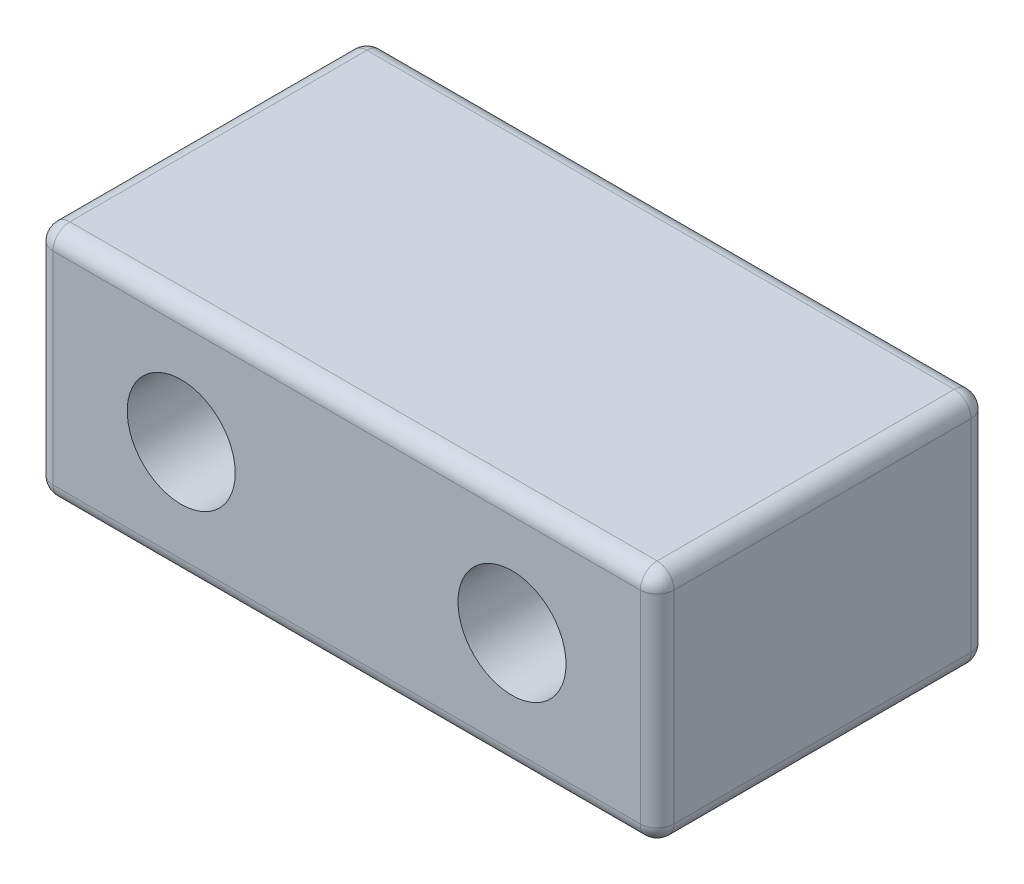
ISO-10303-21;
HEADER;
FILE_DESCRIPTION(('STEP AP214'),'2;1');
FILE_NAME('part.step','',(''),(''),'','','');
FILE_SCHEMA(('AUTOMOTIVE_DESIGN { 1 0 10303 214 1 1 1 1 }'));
ENDSEC;
DATA;
#1=APPLICATION_CONTEXT('core data for automotive mechanical design processes');
#2=APPLICATION_PROTOCOL_DEFINITION('international standard','automotive_design',2000,#1);
#3=PRODUCT_CONTEXT('',#1,'mechanical');
#4=PRODUCT('Part','Part','',(#3));
#5=PRODUCT_RELATED_PRODUCT_CATEGORY('part','',(#4));
#6=PRODUCT_DEFINITION_FORMATION('','',#4);
#7=PRODUCT_DEFINITION_CONTEXT('part definition',#1,'design');
#8=PRODUCT_DEFINITION('design','',#6,#7);
#9=PRODUCT_DEFINITION_SHAPE('','',#8);
#10=(LENGTH_UNIT() NAMED_UNIT(*) SI_UNIT(.MILLI.,.METRE.));
#11=(NAMED_UNIT(*) PLANE_ANGLE_UNIT() SI_UNIT($,.RADIAN.));
#12=(NAMED_UNIT(*) SI_UNIT($,.STERADIAN.) SOLID_ANGLE_UNIT());
#13=UNCERTAINTY_MEASURE_WITH_UNIT(LENGTH_MEASURE(1.E-05),#10,'distance_accuracy_value','');
#14=(GEOMETRIC_REPRESENTATION_CONTEXT(3) GLOBAL_UNCERTAINTY_ASSIGNED_CONTEXT((#13)) GLOBAL_UNIT_ASSIGNED_CONTEXT((#10,
#11,#12)) REPRESENTATION_CONTEXT('',''));
#15=CARTESIAN_POINT('',(0.,0.,0.));
#16=DIRECTION('',(0.,0.,1.));
#17=DIRECTION('',(1.,0.,0.));
#18=AXIS2_PLACEMENT_3D('',#15,#16,#17);
#19=CARTESIAN_POINT('',(0.,0.,9.8));
#20=DIRECTION('',(1.,0.,0.));
#21=DIRECTION('',(0.,0.,-1.));
#22=AXIS2_PLACEMENT_3D('',#19,#20,#21);
#23=PLANE('',#22);
#24=DIRECTION('',(0.,0.,-1.));
#25=VECTOR('',#24,1.);
#26=CARTESIAN_POINT('',(0.,6.5,9.8));
#27=LINE('',#26,#25);
#28=CARTESIAN_POINT('',(0.,6.5,9.3));
#29=VERTEX_POINT('',#28);
#30=CARTESIAN_POINT('',(0.,6.5,0.5));
#31=VERTEX_POINT('',#30);
#32=EDGE_CURVE('E133',#29,#31,#27,.T.);
#33=ORIENTED_EDGE('',*,*,#32,.T.);
#34=DIRECTION('',(0.,-1.,0.));
#35=VECTOR('',#34,1.);
#36=CARTESIAN_POINT('',(0.,0.,0.5));
#37=LINE('',#36,#35);
#38=CARTESIAN_POINT('',(0.,0.5,0.5));
#39=VERTEX_POINT('',#38);
#40=EDGE_CURVE('E129',#31,#39,#37,.T.);
#41=ORIENTED_EDGE('',*,*,#40,.T.);
#42=DIRECTION('',(0.,0.,-1.));
#43=VECTOR('',#42,1.);
#44=CARTESIAN_POINT('',(0.,0.5,9.8));
#45=LINE('',#44,#43);
#46=CARTESIAN_POINT('',(0.,0.5,9.3));
#47=VERTEX_POINT('',#46);
#48=EDGE_CURVE('E124',#39,#47,#45,.F.);
#49=ORIENTED_EDGE('',*,*,#48,.T.);
#50=DIRECTION('',(0.,-1.,0.));
#51=VECTOR('',#50,1.);
#52=CARTESIAN_POINT('',(0.,0.,9.3));
#53=LINE('',#52,#51);
#54=EDGE_CURVE('E126',#47,#29,#53,.F.);
#55=ORIENTED_EDGE('',*,*,#54,.T.);
#56=EDGE_LOOP('',(#33,#41,#49,#55));
#57=FACE_BOUND('',#56,.T.);
#58=ADVANCED_FACE('F35',(#57),#23,.F.);
#59=CARTESIAN_POINT('',(0.,0.,9.8));
#60=DIRECTION('',(0.,1.,0.));
#61=DIRECTION('',(0.,0.,1.));
#62=AXIS2_PLACEMENT_3D('',#59,#60,#61);
#63=PLANE('',#62);
#64=DIRECTION('',(0.,0.,-1.));
#65=VECTOR('',#64,1.);
#66=CARTESIAN_POINT('',(0.5,0.,9.8));
#67=LINE('',#66,#65);
#68=CARTESIAN_POINT('',(0.5,0.,9.3));
#69=VERTEX_POINT('',#68);
#70=CARTESIAN_POINT('',(0.5,0.,0.5));
#71=VERTEX_POINT('',#70);
#72=EDGE_CURVE('E155',#69,#71,#67,.T.);
#73=ORIENTED_EDGE('',*,*,#72,.T.);
#74=DIRECTION('',(1.,0.,0.));
#75=VECTOR('',#74,1.);
#76=CARTESIAN_POINT('',(18.4,0.,0.5));
#77=LINE('',#76,#75);
#78=CARTESIAN_POINT('',(17.9,0.,0.5));
#79=VERTEX_POINT('',#78);
#80=EDGE_CURVE('E231',#71,#79,#77,.T.);
#81=ORIENTED_EDGE('',*,*,#80,.T.);
#82=DIRECTION('',(0.,0.,-1.));
#83=VECTOR('',#82,1.);
#84=CARTESIAN_POINT('',(17.9,0.,9.8));
#85=LINE('',#84,#83);
#86=CARTESIAN_POINT('',(17.9,0.,9.3));
#87=VERTEX_POINT('',#86);
#88=EDGE_CURVE('E229',#79,#87,#85,.F.);
#89=ORIENTED_EDGE('',*,*,#88,.T.);
#90=DIRECTION('',(1.,0.,0.));
#91=VECTOR('',#90,1.);
#92=CARTESIAN_POINT('',(0.,0.,9.3));
#93=LINE('',#92,#91);
#94=EDGE_CURVE('E226',#87,#69,#93,.F.);
#95=ORIENTED_EDGE('',*,*,#94,.T.);
#96=EDGE_LOOP('',(#73,#81,#89,#95));
#97=FACE_BOUND('',#96,.T.);
#98=ADVANCED_FACE('F297',(#97),#63,.F.);
#99=CARTESIAN_POINT('',(18.4,0.,9.8));
#100=DIRECTION('',(-1.,0.,0.));
#101=DIRECTION('',(0.,0.,1.));
#102=AXIS2_PLACEMENT_3D('',#99,#100,#101);
#103=PLANE('',#102);
#104=DIRECTION('',(0.,1.,0.));
#105=VECTOR('',#104,1.);
#106=CARTESIAN_POINT('',(18.4,7.,0.5));
#107=LINE('',#106,#105);
#108=CARTESIAN_POINT('',(18.4,0.5,0.5));
#109=VERTEX_POINT('',#108);
#110=CARTESIAN_POINT('',(18.4,6.5,0.5));
#111=VERTEX_POINT('',#110);
#112=EDGE_CURVE('E238',#109,#111,#107,.T.);
#113=ORIENTED_EDGE('',*,*,#112,.T.);
#114=DIRECTION('',(0.,0.,-1.));
#115=VECTOR('',#114,1.);
#116=CARTESIAN_POINT('',(18.4,6.5,9.8));
#117=LINE('',#116,#115);
#118=CARTESIAN_POINT('',(18.4,6.5,9.3));
#119=VERTEX_POINT('',#118);
#120=EDGE_CURVE('E241',#111,#119,#117,.F.);
#121=ORIENTED_EDGE('',*,*,#120,.T.);
#122=DIRECTION('',(0.,1.,0.));
#123=VECTOR('',#122,1.);
#124=CARTESIAN_POINT('',(18.4,0.,9.3));
#125=LINE('',#124,#123);
#126=CARTESIAN_POINT('',(18.4,0.5,9.3));
#127=VERTEX_POINT('',#126);
#128=EDGE_CURVE('E236',#119,#127,#125,.F.);
#129=ORIENTED_EDGE('',*,*,#128,.T.);
#130=DIRECTION('',(0.,0.,-1.));
#131=VECTOR('',#130,1.);
#132=CARTESIAN_POINT('',(18.4,0.5,9.8));
#133=LINE('',#132,#131);
#134=EDGE_CURVE('E234',#127,#109,#133,.T.);
#135=ORIENTED_EDGE('',*,*,#134,.T.);
#136=EDGE_LOOP('',(#113,#121,#129,#135));
#137=FACE_BOUND('',#136,.T.);
#138=ADVANCED_FACE('F309',(#137),#103,.F.);
#139=CARTESIAN_POINT('',(0.,7.,9.8));
#140=DIRECTION('',(0.,-1.,0.));
#141=DIRECTION('',(0.,0.,-1.));
#142=AXIS2_PLACEMENT_3D('',#139,#140,#141);
#143=PLANE('',#142);
#144=DIRECTION('',(-1.,0.,0.));
#145=VECTOR('',#144,1.);
#146=CARTESIAN_POINT('',(0.,7.,0.5));
#147=LINE('',#146,#145);
#148=CARTESIAN_POINT('',(17.9,7.,0.5));
#149=VERTEX_POINT('',#148);
#150=CARTESIAN_POINT('',(0.5,7.,0.5));
#151=VERTEX_POINT('',#150);
#152=EDGE_CURVE('E247',#149,#151,#147,.T.);
#153=ORIENTED_EDGE('',*,*,#152,.T.);
#154=DIRECTION('',(0.,0.,-1.));
#155=VECTOR('',#154,1.);
#156=CARTESIAN_POINT('',(0.5,7.,9.8));
#157=LINE('',#156,#155);
#158=CARTESIAN_POINT('',(0.5,7.,9.3));
#159=VERTEX_POINT('',#158);
#160=EDGE_CURVE('E250',#151,#159,#157,.F.);
#161=ORIENTED_EDGE('',*,*,#160,.T.);
#162=DIRECTION('',(-1.,0.,0.));
#163=VECTOR('',#162,1.);
#164=CARTESIAN_POINT('',(0.,7.,9.3));
#165=LINE('',#164,#163);
#166=CARTESIAN_POINT('',(17.9,7.,9.3));
#167=VERTEX_POINT('',#166);
#168=EDGE_CURVE('E245',#159,#167,#165,.F.);
#169=ORIENTED_EDGE('',*,*,#168,.T.);
#170=DIRECTION('',(0.,0.,-1.));
#171=VECTOR('',#170,1.);
#172=CARTESIAN_POINT('',(17.9,7.,9.8));
#173=LINE('',#172,#171);
#174=EDGE_CURVE('E243',#167,#149,#173,.T.);
#175=ORIENTED_EDGE('',*,*,#174,.T.);
#176=EDGE_LOOP('',(#153,#161,#169,#175));
#177=FACE_BOUND('',#176,.T.);
#178=ADVANCED_FACE('F326',(#177),#143,.F.);
#179=CARTESIAN_POINT('',(0.,0.,9.8));
#180=DIRECTION('',(0.,0.,-1.));
#181=DIRECTION('',(-1.,0.,0.));
#182=AXIS2_PLACEMENT_3D('',#179,#180,#181);
#183=PLANE('',#182);
#184=DIRECTION('',(1.,0.,0.));
#185=VECTOR('',#184,1.);
#186=CARTESIAN_POINT('',(0.,0.5,9.8));
#187=LINE('',#186,#185);
#188=CARTESIAN_POINT('',(0.5,0.5,9.8));
#189=VERTEX_POINT('',#188);
#190=CARTESIAN_POINT('',(17.9,0.5,9.8));
#191=VERTEX_POINT('',#190);
#192=EDGE_CURVE('E252',#189,#191,#187,.T.);
#193=ORIENTED_EDGE('',*,*,#192,.T.);
#194=DIRECTION('',(0.,1.,0.));
#195=VECTOR('',#194,1.);
#196=CARTESIAN_POINT('',(17.9,0.,9.8));
#197=LINE('',#196,#195);
#198=CARTESIAN_POINT('',(17.9,6.5,9.8));
#199=VERTEX_POINT('',#198);
#200=EDGE_CURVE('E11',#191,#199,#197,.T.);
#201=ORIENTED_EDGE('',*,*,#200,.T.);
#202=DIRECTION('',(-1.,0.,0.));
#203=VECTOR('',#202,1.);
#204=CARTESIAN_POINT('',(0.,6.5,9.8));
#205=LINE('',#204,#203);
#206=CARTESIAN_POINT('',(0.5,6.5,9.8));
#207=VERTEX_POINT('',#206);
#208=EDGE_CURVE('E44',#199,#207,#205,.T.);
#209=ORIENTED_EDGE('',*,*,#208,.T.);
#210=DIRECTION('',(0.,-1.,0.));
#211=VECTOR('',#210,1.);
#212=CARTESIAN_POINT('',(0.5,0.,9.8));
#213=LINE('',#212,#211);
#214=EDGE_CURVE('E254',#207,#189,#213,.T.);
#215=ORIENTED_EDGE('',*,*,#214,.T.);
#216=EDGE_LOOP('',(#193,#201,#209,#215));
#217=FACE_BOUND('',#216,.T.);
#218=CARTESIAN_POINT('',(4.3,3.5,9.8));
#219=DIRECTION('',(0.,0.,1.));
#220=DIRECTION('',(1.,0.,0.));
#221=AXIS2_PLACEMENT_3D('',#218,#219,#220);
#222=CIRCLE('',#221,1.6);
#223=CARTESIAN_POINT('',(5.9,3.5,9.8));
#224=VERTEX_POINT('',#223);
#225=EDGE_CURVE('E211',#224,#224,#222,.T.);
#226=ORIENTED_EDGE('',*,*,#225,.F.);
#227=EDGE_LOOP('',(#226));
#228=FACE_BOUND('',#227,.T.);
#229=CARTESIAN_POINT('',(14.1,3.5,9.8));
#230=DIRECTION('',(0.,0.,1.));
#231=DIRECTION('',(1.,0.,0.));
#232=AXIS2_PLACEMENT_3D('',#229,#230,#231);
#233=CIRCLE('',#232,1.6);
#234=CARTESIAN_POINT('',(15.7,3.5,9.8));
#235=VERTEX_POINT('',#234);
#236=EDGE_CURVE('E201',#235,#235,#233,.T.);
#237=ORIENTED_EDGE('',*,*,#236,.F.);
#238=EDGE_LOOP('',(#237));
#239=FACE_BOUND('',#238,.T.);
#240=ADVANCED_FACE('F304',(#217,#228,#239),#183,.F.);
#241=CARTESIAN_POINT('',(0.,0.,0.));
#242=DIRECTION('',(0.,0.,-1.));
#243=DIRECTION('',(-1.,0.,0.));
#244=AXIS2_PLACEMENT_3D('',#241,#242,#243);
#245=PLANE('',#244);
#246=DIRECTION('',(1.,0.,0.));
#247=VECTOR('',#246,1.);
#248=CARTESIAN_POINT('',(0.,0.5,0.));
#249=LINE('',#248,#247);
#250=CARTESIAN_POINT('',(17.9,0.5,0.));
#251=VERTEX_POINT('',#250);
#252=CARTESIAN_POINT('',(0.5,0.5,0.));
#253=VERTEX_POINT('',#252);
#254=EDGE_CURVE('E221',#251,#253,#249,.F.);
#255=ORIENTED_EDGE('',*,*,#254,.T.);
#256=DIRECTION('',(0.,-1.,0.));
#257=VECTOR('',#256,1.);
#258=CARTESIAN_POINT('',(0.5,7.,0.));
#259=LINE('',#258,#257);
#260=CARTESIAN_POINT('',(0.5,6.5,0.));
#261=VERTEX_POINT('',#260);
#262=EDGE_CURVE('E223',#253,#261,#259,.F.);
#263=ORIENTED_EDGE('',*,*,#262,.T.);
#264=DIRECTION('',(-1.,0.,0.));
#265=VECTOR('',#264,1.);
#266=CARTESIAN_POINT('',(18.4,6.5,0.));
#267=LINE('',#266,#265);
#268=CARTESIAN_POINT('',(17.9,6.5,0.));
#269=VERTEX_POINT('',#268);
#270=EDGE_CURVE('E217',#261,#269,#267,.F.);
#271=ORIENTED_EDGE('',*,*,#270,.T.);
#272=DIRECTION('',(0.,1.,0.));
#273=VECTOR('',#272,1.);
#274=CARTESIAN_POINT('',(17.9,0.,0.));
#275=LINE('',#274,#273);
#276=EDGE_CURVE('E219',#269,#251,#275,.F.);
#277=ORIENTED_EDGE('',*,*,#276,.T.);
#278=EDGE_LOOP('',(#255,#263,#271,#277));
#279=FACE_BOUND('',#278,.T.);
#280=CARTESIAN_POINT('',(4.3,3.5,0.));
#281=DIRECTION('',(0.,0.,1.));
#282=DIRECTION('',(1.,0.,0.));
#283=AXIS2_PLACEMENT_3D('',#280,#281,#282);
#284=CIRCLE('',#283,1.6);
#285=CARTESIAN_POINT('',(5.9,3.5,0.));
#286=VERTEX_POINT('',#285);
#287=EDGE_CURVE('E144',#286,#286,#284,.T.);
#288=ORIENTED_EDGE('',*,*,#287,.T.);
#289=EDGE_LOOP('',(#288));
#290=FACE_BOUND('',#289,.T.);
#291=CARTESIAN_POINT('',(14.1,3.5,0.));
#292=DIRECTION('',(0.,0.,1.));
#293=DIRECTION('',(1.,0.,0.));
#294=AXIS2_PLACEMENT_3D('',#291,#292,#293);
#295=CIRCLE('',#294,1.6);
#296=CARTESIAN_POINT('',(15.7,3.5,0.));
#297=VERTEX_POINT('',#296);
#298=EDGE_CURVE('E206',#297,#297,#295,.T.);
#299=ORIENTED_EDGE('',*,*,#298,.T.);
#300=EDGE_LOOP('',(#299));
#301=FACE_BOUND('',#300,.T.);
#302=ADVANCED_FACE('F283',(#279,#290,#301),#245,.T.);
#303=CARTESIAN_POINT('',(14.1,3.5,0.));
#304=DIRECTION('',(0.,0.,1.));
#305=DIRECTION('',(1.,0.,0.));
#306=AXIS2_PLACEMENT_3D('',#303,#304,#305);
#307=CYLINDRICAL_SURFACE('',#306,1.6);
#308=ORIENTED_EDGE('',*,*,#298,.F.);
#309=EDGE_LOOP('',(#308));
#310=FACE_BOUND('',#309,.T.);
#311=ORIENTED_EDGE('',*,*,#236,.T.);
#312=EDGE_LOOP('',(#311));
#313=FACE_BOUND('',#312,.T.);
#314=ADVANCED_FACE('F395',(#310,#313),#307,.F.);
#315=CARTESIAN_POINT('',(4.3,3.5,0.));
#316=DIRECTION('',(0.,0.,1.));
#317=DIRECTION('',(1.,0.,0.));
#318=AXIS2_PLACEMENT_3D('',#315,#316,#317);
#319=CYLINDRICAL_SURFACE('',#318,1.6);
#320=ORIENTED_EDGE('',*,*,#287,.F.);
#321=EDGE_LOOP('',(#320));
#322=FACE_BOUND('',#321,.T.);
#323=ORIENTED_EDGE('',*,*,#225,.T.);
#324=EDGE_LOOP('',(#323));
#325=FACE_BOUND('',#324,.T.);
#326=ADVANCED_FACE('F391',(#322,#325),#319,.F.);
#327=CARTESIAN_POINT('',(17.9,0.,9.3));
#328=DIRECTION('',(0.,1.,0.));
#329=DIRECTION('',(0.,0.,1.));
#330=AXIS2_PLACEMENT_3D('',#327,#328,#329);
#331=CYLINDRICAL_SURFACE('',#330,0.5);
#332=CARTESIAN_POINT('',(17.9,6.5,9.3));
#333=DIRECTION('',(0.,1.,0.));
#334=DIRECTION('',(0.,0.,1.));
#335=AXIS2_PLACEMENT_3D('',#332,#333,#334);
#336=CIRCLE('',#335,0.5);
#337=EDGE_CURVE('E39',#199,#119,#336,.T.);
#338=ORIENTED_EDGE('',*,*,#337,.F.);
#339=ORIENTED_EDGE('',*,*,#200,.F.);
#340=CARTESIAN_POINT('',(17.9,0.5,9.3));
#341=DIRECTION('',(0.,-1.,0.));
#342=DIRECTION('',(0.,0.,-1.));
#343=AXIS2_PLACEMENT_3D('',#340,#341,#342);
#344=CIRCLE('',#343,0.5);
#345=EDGE_CURVE('E194',#127,#191,#344,.T.);
#346=ORIENTED_EDGE('',*,*,#345,.F.);
#347=ORIENTED_EDGE('',*,*,#128,.F.);
#348=EDGE_LOOP('',(#338,#339,#346,#347));
#349=FACE_BOUND('',#348,.T.);
#350=ADVANCED_FACE('F37',(#349),#331,.T.);
#351=CARTESIAN_POINT('',(17.9,6.5,9.3));
#352=DIRECTION('',(1.,0.,0.));
#353=DIRECTION('',(0.,0.,-1.));
#354=AXIS2_PLACEMENT_3D('',#351,#352,#353);
#355=SPHERICAL_SURFACE('',#354,0.5);
#356=CARTESIAN_POINT('',(17.9,6.5,9.3));
#357=DIRECTION('',(1.,0.,0.));
#358=DIRECTION('',(0.,0.,-1.));
#359=AXIS2_PLACEMENT_3D('',#356,#357,#358);
#360=CIRCLE('',#359,0.5);
#361=EDGE_CURVE('E190',#199,#167,#360,.F.);
#362=ORIENTED_EDGE('',*,*,#361,.F.);
#363=ORIENTED_EDGE('',*,*,#337,.T.);
#364=CARTESIAN_POINT('',(17.9,6.5,9.3));
#365=DIRECTION('',(0.,0.,1.));
#366=DIRECTION('',(1.,0.,0.));
#367=AXIS2_PLACEMENT_3D('',#364,#365,#366);
#368=CIRCLE('',#367,0.5);
#369=EDGE_CURVE('E192',#167,#119,#368,.F.);
#370=ORIENTED_EDGE('',*,*,#369,.F.);
#371=EDGE_LOOP('',(#362,#363,#370));
#372=FACE_BOUND('',#371,.T.);
#373=ADVANCED_FACE('F317',(#372),#355,.T.);
#374=CARTESIAN_POINT('',(17.9,0.5,9.3));
#375=DIRECTION('',(0.,0.,1.));
#376=DIRECTION('',(1.,0.,0.));
#377=AXIS2_PLACEMENT_3D('',#374,#375,#376);
#378=SPHERICAL_SURFACE('',#377,0.5);
#379=CARTESIAN_POINT('',(17.9,0.5,9.3));
#380=DIRECTION('',(0.,0.,1.));
#381=DIRECTION('',(1.,0.,0.));
#382=AXIS2_PLACEMENT_3D('',#379,#380,#381);
#383=CIRCLE('',#382,0.5);
#384=EDGE_CURVE('E184',#127,#87,#383,.F.);
#385=ORIENTED_EDGE('',*,*,#384,.F.);
#386=ORIENTED_EDGE('',*,*,#345,.T.);
#387=CARTESIAN_POINT('',(17.9,0.5,9.3));
#388=DIRECTION('',(1.,0.,0.));
#389=DIRECTION('',(0.,0.,-1.));
#390=AXIS2_PLACEMENT_3D('',#387,#388,#389);
#391=CIRCLE('',#390,0.5);
#392=EDGE_CURVE('E187',#87,#191,#391,.F.);
#393=ORIENTED_EDGE('',*,*,#392,.F.);
#394=EDGE_LOOP('',(#385,#386,#393));
#395=FACE_BOUND('',#394,.T.);
#396=ADVANCED_FACE('F385',(#395),#378,.T.);
#397=CARTESIAN_POINT('',(17.9,6.5,9.8));
#398=DIRECTION('',(0.,0.,-1.));
#399=DIRECTION('',(-1.,0.,0.));
#400=AXIS2_PLACEMENT_3D('',#397,#398,#399);
#401=CYLINDRICAL_SURFACE('',#400,0.5);
#402=ORIENTED_EDGE('',*,*,#369,.T.);
#403=ORIENTED_EDGE('',*,*,#120,.F.);
#404=CARTESIAN_POINT('',(17.9,6.5,0.5));
#405=DIRECTION('',(0.,0.,-1.));
#406=DIRECTION('',(-1.,0.,0.));
#407=AXIS2_PLACEMENT_3D('',#404,#405,#406);
#408=CIRCLE('',#407,0.5);
#409=EDGE_CURVE('E179',#149,#111,#408,.T.);
#410=ORIENTED_EDGE('',*,*,#409,.F.);
#411=ORIENTED_EDGE('',*,*,#174,.F.);
#412=EDGE_LOOP('',(#402,#403,#410,#411));
#413=FACE_BOUND('',#412,.T.);
#414=ADVANCED_FACE('F315',(#413),#401,.T.);
#415=CARTESIAN_POINT('',(0.,6.5,9.3));
#416=DIRECTION('',(-1.,0.,0.));
#417=DIRECTION('',(0.,0.,1.));
#418=AXIS2_PLACEMENT_3D('',#415,#416,#417);
#419=CYLINDRICAL_SURFACE('',#418,0.5);
#420=ORIENTED_EDGE('',*,*,#361,.T.);
#421=ORIENTED_EDGE('',*,*,#168,.F.);
#422=CARTESIAN_POINT('',(0.5,6.5,9.3));
#423=DIRECTION('',(-1.,0.,0.));
#424=DIRECTION('',(0.,0.,1.));
#425=AXIS2_PLACEMENT_3D('',#422,#423,#424);
#426=CIRCLE('',#425,0.5);
#427=EDGE_CURVE('E176',#207,#159,#426,.T.);
#428=ORIENTED_EDGE('',*,*,#427,.F.);
#429=ORIENTED_EDGE('',*,*,#208,.F.);
#430=EDGE_LOOP('',(#420,#421,#428,#429));
#431=FACE_BOUND('',#430,.T.);
#432=ADVANCED_FACE('F319',(#431),#419,.T.);
#433=CARTESIAN_POINT('',(0.5,0.,9.3));
#434=DIRECTION('',(0.,-1.,0.));
#435=DIRECTION('',(0.,0.,-1.));
#436=AXIS2_PLACEMENT_3D('',#433,#434,#435);
#437=CYLINDRICAL_SURFACE('',#436,0.5);
#438=CARTESIAN_POINT('',(0.5,0.5,9.3));
#439=DIRECTION('',(0.,-1.,0.));
#440=DIRECTION('',(0.,0.,-1.));
#441=AXIS2_PLACEMENT_3D('',#438,#439,#440);
#442=CIRCLE('',#441,0.5);
#443=EDGE_CURVE('E139',#189,#47,#442,.T.);
#444=ORIENTED_EDGE('',*,*,#443,.F.);
#445=ORIENTED_EDGE('',*,*,#214,.F.);
#446=CARTESIAN_POINT('',(0.5,6.5,9.3));
#447=DIRECTION('',(0.,1.,0.));
#448=DIRECTION('',(0.,0.,1.));
#449=AXIS2_PLACEMENT_3D('',#446,#447,#448);
#450=CIRCLE('',#449,0.5);
#451=EDGE_CURVE('E142',#29,#207,#450,.T.);
#452=ORIENTED_EDGE('',*,*,#451,.F.);
#453=ORIENTED_EDGE('',*,*,#54,.F.);
#454=EDGE_LOOP('',(#444,#445,#452,#453));
#455=FACE_BOUND('',#454,.T.);
#456=ADVANCED_FACE('F138',(#455),#437,.T.);
#457=CARTESIAN_POINT('',(0.,0.5,9.3));
#458=DIRECTION('',(1.,0.,0.));
#459=DIRECTION('',(0.,0.,-1.));
#460=AXIS2_PLACEMENT_3D('',#457,#458,#459);
#461=CYLINDRICAL_SURFACE('',#460,0.5);
#462=ORIENTED_EDGE('',*,*,#392,.T.);
#463=ORIENTED_EDGE('',*,*,#192,.F.);
#464=CARTESIAN_POINT('',(0.5,0.5,9.3));
#465=DIRECTION('',(-1.,0.,0.));
#466=DIRECTION('',(0.,0.,1.));
#467=AXIS2_PLACEMENT_3D('',#464,#465,#466);
#468=CIRCLE('',#467,0.5);
#469=EDGE_CURVE('E152',#69,#189,#468,.T.);
#470=ORIENTED_EDGE('',*,*,#469,.F.);
#471=ORIENTED_EDGE('',*,*,#94,.F.);
#472=EDGE_LOOP('',(#462,#463,#470,#471));
#473=FACE_BOUND('',#472,.T.);
#474=ADVANCED_FACE('F302',(#473),#461,.T.);
#475=CARTESIAN_POINT('',(17.9,0.5,9.8));
#476=DIRECTION('',(0.,0.,-1.));
#477=DIRECTION('',(-1.,0.,0.));
#478=AXIS2_PLACEMENT_3D('',#475,#476,#477);
#479=CYLINDRICAL_SURFACE('',#478,0.5);
#480=ORIENTED_EDGE('',*,*,#384,.T.);
#481=ORIENTED_EDGE('',*,*,#88,.F.);
#482=CARTESIAN_POINT('',(17.9,0.5,0.5));
#483=DIRECTION('',(0.,0.,-1.));
#484=DIRECTION('',(-1.,0.,0.));
#485=AXIS2_PLACEMENT_3D('',#482,#483,#484);
#486=CIRCLE('',#485,0.5);
#487=EDGE_CURVE('E171',#109,#79,#486,.T.);
#488=ORIENTED_EDGE('',*,*,#487,.F.);
#489=ORIENTED_EDGE('',*,*,#134,.F.);
#490=EDGE_LOOP('',(#480,#481,#488,#489));
#491=FACE_BOUND('',#490,.T.);
#492=ADVANCED_FACE('F372',(#491),#479,.T.);
#493=CARTESIAN_POINT('',(17.9,0.,0.5));
#494=DIRECTION('',(0.,-1.,0.));
#495=DIRECTION('',(0.,0.,-1.));
#496=AXIS2_PLACEMENT_3D('',#493,#494,#495);
#497=CYLINDRICAL_SURFACE('',#496,0.5);
#498=CARTESIAN_POINT('',(17.9,6.5,0.5));
#499=DIRECTION('',(0.,1.,0.));
#500=DIRECTION('',(0.,0.,1.));
#501=AXIS2_PLACEMENT_3D('',#498,#499,#500);
#502=CIRCLE('',#501,0.5);
#503=EDGE_CURVE('E181',#111,#269,#502,.T.);
#504=ORIENTED_EDGE('',*,*,#503,.F.);
#505=ORIENTED_EDGE('',*,*,#112,.F.);
#506=CARTESIAN_POINT('',(17.9,0.5,0.5));
#507=DIRECTION('',(0.,-1.,0.));
#508=DIRECTION('',(0.,0.,-1.));
#509=AXIS2_PLACEMENT_3D('',#506,#507,#508);
#510=CIRCLE('',#509,0.5);
#511=EDGE_CURVE('E168',#251,#109,#510,.T.);
#512=ORIENTED_EDGE('',*,*,#511,.F.);
#513=ORIENTED_EDGE('',*,*,#276,.F.);
#514=EDGE_LOOP('',(#504,#505,#512,#513));
#515=FACE_BOUND('',#514,.T.);
#516=ADVANCED_FACE('F368',(#515),#497,.T.);
#517=CARTESIAN_POINT('',(17.9,6.5,0.5));
#518=DIRECTION('',(1.,0.,0.));
#519=DIRECTION('',(0.,0.,-1.));
#520=AXIS2_PLACEMENT_3D('',#517,#518,#519);
#521=SPHERICAL_SURFACE('',#520,0.5);
#522=ORIENTED_EDGE('',*,*,#409,.T.);
#523=ORIENTED_EDGE('',*,*,#503,.T.);
#524=CARTESIAN_POINT('',(17.9,6.5,0.5));
#525=DIRECTION('',(1.,0.,0.));
#526=DIRECTION('',(0.,0.,-1.));
#527=AXIS2_PLACEMENT_3D('',#524,#525,#526);
#528=CIRCLE('',#527,0.5);
#529=EDGE_CURVE('E160',#149,#269,#528,.F.);
#530=ORIENTED_EDGE('',*,*,#529,.F.);
#531=EDGE_LOOP('',(#522,#523,#530));
#532=FACE_BOUND('',#531,.T.);
#533=ADVANCED_FACE('F365',(#532),#521,.T.);
#534=CARTESIAN_POINT('',(0.5,6.5,9.3));
#535=DIRECTION('',(0.,0.,1.));
#536=DIRECTION('',(1.,0.,0.));
#537=AXIS2_PLACEMENT_3D('',#534,#535,#536);
#538=SPHERICAL_SURFACE('',#537,0.5);
#539=ORIENTED_EDGE('',*,*,#451,.T.);
#540=ORIENTED_EDGE('',*,*,#427,.T.);
#541=CARTESIAN_POINT('',(0.5,6.5,9.3));
#542=DIRECTION('',(0.,0.,1.));
#543=DIRECTION('',(1.,0.,0.));
#544=AXIS2_PLACEMENT_3D('',#541,#542,#543);
#545=CIRCLE('',#544,0.5);
#546=EDGE_CURVE('E156',#29,#159,#545,.F.);
#547=ORIENTED_EDGE('',*,*,#546,.F.);
#548=EDGE_LOOP('',(#539,#540,#547));
#549=FACE_BOUND('',#548,.T.);
#550=ADVANCED_FACE('F322',(#549),#538,.T.);
#551=CARTESIAN_POINT('',(0.5,0.5,9.3));
#552=DIRECTION('',(0.,0.,1.));
#553=DIRECTION('',(1.,0.,0.));
#554=AXIS2_PLACEMENT_3D('',#551,#552,#553);
#555=SPHERICAL_SURFACE('',#554,0.5);
#556=ORIENTED_EDGE('',*,*,#469,.T.);
#557=ORIENTED_EDGE('',*,*,#443,.T.);
#558=CARTESIAN_POINT('',(0.5,0.5,9.3));
#559=DIRECTION('',(0.,0.,1.));
#560=DIRECTION('',(1.,0.,0.));
#561=AXIS2_PLACEMENT_3D('',#558,#559,#560);
#562=CIRCLE('',#561,0.5);
#563=EDGE_CURVE('E149',#69,#47,#562,.F.);
#564=ORIENTED_EDGE('',*,*,#563,.F.);
#565=EDGE_LOOP('',(#556,#557,#564));
#566=FACE_BOUND('',#565,.T.);
#567=ADVANCED_FACE('F148',(#566),#555,.T.);
#568=CARTESIAN_POINT('',(17.9,0.5,0.5));
#569=DIRECTION('',(1.,0.,0.));
#570=DIRECTION('',(0.,0.,-1.));
#571=AXIS2_PLACEMENT_3D('',#568,#569,#570);
#572=SPHERICAL_SURFACE('',#571,0.5);
#573=ORIENTED_EDGE('',*,*,#511,.T.);
#574=ORIENTED_EDGE('',*,*,#487,.T.);
#575=CARTESIAN_POINT('',(17.9,0.5,0.5));
#576=DIRECTION('',(1.,0.,0.));
#577=DIRECTION('',(0.,0.,-1.));
#578=AXIS2_PLACEMENT_3D('',#575,#576,#577);
#579=CIRCLE('',#578,0.5);
#580=EDGE_CURVE('E157',#251,#79,#579,.F.);
#581=ORIENTED_EDGE('',*,*,#580,.F.);
#582=EDGE_LOOP('',(#573,#574,#581));
#583=FACE_BOUND('',#582,.T.);
#584=ADVANCED_FACE('F357',(#583),#572,.T.);
#585=CARTESIAN_POINT('',(0.,6.5,0.5));
#586=DIRECTION('',(1.,0.,0.));
#587=DIRECTION('',(0.,0.,-1.));
#588=AXIS2_PLACEMENT_3D('',#585,#586,#587);
#589=CYLINDRICAL_SURFACE('',#588,0.5);
#590=ORIENTED_EDGE('',*,*,#529,.T.);
#591=ORIENTED_EDGE('',*,*,#270,.F.);
#592=CARTESIAN_POINT('',(0.5,6.5,0.5));
#593=DIRECTION('',(-1.,0.,0.));
#594=DIRECTION('',(0.,0.,1.));
#595=AXIS2_PLACEMENT_3D('',#592,#593,#594);
#596=CIRCLE('',#595,0.5);
#597=EDGE_CURVE('E162',#151,#261,#596,.T.);
#598=ORIENTED_EDGE('',*,*,#597,.F.);
#599=ORIENTED_EDGE('',*,*,#152,.F.);
#600=EDGE_LOOP('',(#590,#591,#598,#599));
#601=FACE_BOUND('',#600,.T.);
#602=ADVANCED_FACE('F278',(#601),#589,.T.);
#603=CARTESIAN_POINT('',(0.5,6.5,9.8));
#604=DIRECTION('',(0.,0.,-1.));
#605=DIRECTION('',(-1.,0.,0.));
#606=AXIS2_PLACEMENT_3D('',#603,#604,#605);
#607=CYLINDRICAL_SURFACE('',#606,0.5);
#608=ORIENTED_EDGE('',*,*,#546,.T.);
#609=ORIENTED_EDGE('',*,*,#160,.F.);
#610=CARTESIAN_POINT('',(0.5,6.5,0.5));
#611=DIRECTION('',(0.,0.,-1.));
#612=DIRECTION('',(-1.,0.,0.));
#613=AXIS2_PLACEMENT_3D('',#610,#611,#612);
#614=CIRCLE('',#613,0.5);
#615=EDGE_CURVE('E267',#31,#151,#614,.T.);
#616=ORIENTED_EDGE('',*,*,#615,.F.);
#617=ORIENTED_EDGE('',*,*,#32,.F.);
#618=EDGE_LOOP('',(#608,#609,#616,#617));
#619=FACE_BOUND('',#618,.T.);
#620=ADVANCED_FACE('F325',(#619),#607,.T.);
#621=CARTESIAN_POINT('',(0.5,0.5,9.8));
#622=DIRECTION('',(0.,0.,-1.));
#623=DIRECTION('',(-1.,0.,0.));
#624=AXIS2_PLACEMENT_3D('',#621,#622,#623);
#625=CYLINDRICAL_SURFACE('',#624,0.5);
#626=ORIENTED_EDGE('',*,*,#563,.T.);
#627=ORIENTED_EDGE('',*,*,#48,.F.);
#628=CARTESIAN_POINT('',(0.5,0.5,0.5));
#629=DIRECTION('',(0.,0.,-1.));
#630=DIRECTION('',(-1.,0.,0.));
#631=AXIS2_PLACEMENT_3D('',#628,#629,#630);
#632=CIRCLE('',#631,0.5);
#633=EDGE_CURVE('E264',#71,#39,#632,.T.);
#634=ORIENTED_EDGE('',*,*,#633,.F.);
#635=ORIENTED_EDGE('',*,*,#72,.F.);
#636=EDGE_LOOP('',(#626,#627,#634,#635));
#637=FACE_BOUND('',#636,.T.);
#638=ADVANCED_FACE('F154',(#637),#625,.T.);
#639=CARTESIAN_POINT('',(0.,0.5,0.5));
#640=DIRECTION('',(-1.,0.,0.));
#641=DIRECTION('',(0.,0.,1.));
#642=AXIS2_PLACEMENT_3D('',#639,#640,#641);
#643=CYLINDRICAL_SURFACE('',#642,0.5);
#644=ORIENTED_EDGE('',*,*,#580,.T.);
#645=ORIENTED_EDGE('',*,*,#80,.F.);
#646=CARTESIAN_POINT('',(0.5,0.5,0.5));
#647=DIRECTION('',(-1.,0.,0.));
#648=DIRECTION('',(0.,0.,1.));
#649=AXIS2_PLACEMENT_3D('',#646,#647,#648);
#650=CIRCLE('',#649,0.5);
#651=EDGE_CURVE('E261',#253,#71,#650,.T.);
#652=ORIENTED_EDGE('',*,*,#651,.F.);
#653=ORIENTED_EDGE('',*,*,#254,.F.);
#654=EDGE_LOOP('',(#644,#645,#652,#653));
#655=FACE_BOUND('',#654,.T.);
#656=ADVANCED_FACE('F294',(#655),#643,.T.);
#657=CARTESIAN_POINT('',(0.5,6.5,0.5));
#658=DIRECTION('',(0.,1.,0.));
#659=DIRECTION('',(0.,0.,1.));
#660=AXIS2_PLACEMENT_3D('',#657,#658,#659);
#661=SPHERICAL_SURFACE('',#660,0.5);
#662=ORIENTED_EDGE('',*,*,#615,.T.);
#663=ORIENTED_EDGE('',*,*,#597,.T.);
#664=CARTESIAN_POINT('',(0.5,6.5,0.5));
#665=DIRECTION('',(0.,1.,0.));
#666=DIRECTION('',(0.,0.,1.));
#667=AXIS2_PLACEMENT_3D('',#664,#665,#666);
#668=CIRCLE('',#667,0.5);
#669=EDGE_CURVE('E259',#31,#261,#668,.F.);
#670=ORIENTED_EDGE('',*,*,#669,.F.);
#671=EDGE_LOOP('',(#662,#663,#670));
#672=FACE_BOUND('',#671,.T.);
#673=ADVANCED_FACE('F273',(#672),#661,.T.);
#674=CARTESIAN_POINT('',(0.5,0.5,0.5));
#675=DIRECTION('',(0.,-1.,0.));
#676=DIRECTION('',(0.,0.,-1.));
#677=AXIS2_PLACEMENT_3D('',#674,#675,#676);
#678=SPHERICAL_SURFACE('',#677,0.5);
#679=ORIENTED_EDGE('',*,*,#651,.T.);
#680=ORIENTED_EDGE('',*,*,#633,.T.);
#681=CARTESIAN_POINT('',(0.5,0.5,0.5));
#682=DIRECTION('',(0.,-1.,0.));
#683=DIRECTION('',(0.,0.,-1.));
#684=AXIS2_PLACEMENT_3D('',#681,#682,#683);
#685=CIRCLE('',#684,0.5);
#686=EDGE_CURVE('E257',#253,#39,#685,.F.);
#687=ORIENTED_EDGE('',*,*,#686,.F.);
#688=EDGE_LOOP('',(#679,#680,#687));
#689=FACE_BOUND('',#688,.T.);
#690=ADVANCED_FACE('F291',(#689),#678,.T.);
#691=CARTESIAN_POINT('',(0.5,0.,0.5));
#692=DIRECTION('',(0.,1.,0.));
#693=DIRECTION('',(0.,0.,1.));
#694=AXIS2_PLACEMENT_3D('',#691,#692,#693);
#695=CYLINDRICAL_SURFACE('',#694,0.5);
#696=ORIENTED_EDGE('',*,*,#669,.T.);
#697=ORIENTED_EDGE('',*,*,#262,.F.);
#698=ORIENTED_EDGE('',*,*,#686,.T.);
#699=ORIENTED_EDGE('',*,*,#40,.F.);
#700=EDGE_LOOP('',(#696,#697,#698,#699));
#701=FACE_BOUND('',#700,.T.);
#702=ADVANCED_FACE('F289',(#701),#695,.T.);
#703=CLOSED_SHELL('',(#58,#98,#138,#178,#240,#302,#314,#326,#350,#373,#396,#414,#432,#456,#474,
#492,#516,#533,#550,#567,#584,#602,#620,#638,#656,#673,#690,#702));
#704=MANIFOLD_SOLID_BREP('B2',#703);
#705=ADVANCED_BREP_SHAPE_REPRESENTATION('',(#18,#704),#14);
#706=SHAPE_DEFINITION_REPRESENTATION(#9,#705);
ENDSEC;
END-ISO-10303-21;
